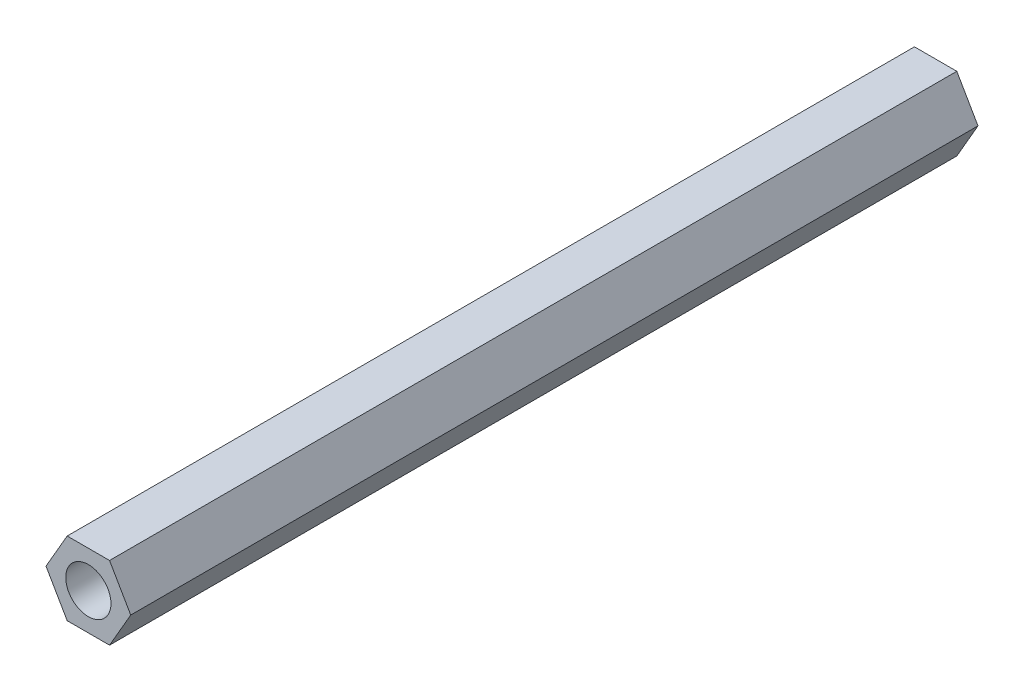
ISO-10303-21;
HEADER;
FILE_DESCRIPTION(('STEP AP214'),'2;1');
FILE_NAME('part.step','',(''),(''),'','','');
FILE_SCHEMA(('AUTOMOTIVE_DESIGN { 1 0 10303 214 1 1 1 1 }'));
ENDSEC;
DATA;
#1=APPLICATION_CONTEXT('core data for automotive mechanical design processes');
#2=APPLICATION_PROTOCOL_DEFINITION('international standard','automotive_design',2000,#1);
#3=PRODUCT_CONTEXT('',#1,'mechanical');
#4=PRODUCT('Part','Part','',(#3));
#5=PRODUCT_RELATED_PRODUCT_CATEGORY('part','',(#4));
#6=PRODUCT_DEFINITION_FORMATION('','',#4);
#7=PRODUCT_DEFINITION_CONTEXT('part definition',#1,'design');
#8=PRODUCT_DEFINITION('design','',#6,#7);
#9=PRODUCT_DEFINITION_SHAPE('','',#8);
#10=(LENGTH_UNIT() NAMED_UNIT(*) SI_UNIT(.MILLI.,.METRE.));
#11=(NAMED_UNIT(*) PLANE_ANGLE_UNIT() SI_UNIT($,.RADIAN.));
#12=(NAMED_UNIT(*) SI_UNIT($,.STERADIAN.) SOLID_ANGLE_UNIT());
#13=UNCERTAINTY_MEASURE_WITH_UNIT(LENGTH_MEASURE(1.E-05),#10,'distance_accuracy_value','');
#14=(GEOMETRIC_REPRESENTATION_CONTEXT(3) GLOBAL_UNCERTAINTY_ASSIGNED_CONTEXT((#13)) GLOBAL_UNIT_ASSIGNED_CONTEXT((#10,
#11,#12)) REPRESENTATION_CONTEXT('',''));
#15=CARTESIAN_POINT('',(0.,0.,0.));
#16=DIRECTION('',(0.,0.,1.));
#17=DIRECTION('',(1.,0.,0.));
#18=AXIS2_PLACEMENT_3D('',#15,#16,#17);
#19=CARTESIAN_POINT('',(0.,0.,60.));
#20=DIRECTION('',(0.,0.,1.));
#21=DIRECTION('',(1.,0.,0.));
#22=AXIS2_PLACEMENT_3D('',#19,#20,#21);
#23=PLANE('',#22);
#24=DIRECTION('',(0.5,0.866025403784438,0.));
#25=VECTOR('',#24,1.);
#26=CARTESIAN_POINT('',(1.5,-2.59807621135332,60.));
#27=LINE('',#26,#25);
#28=CARTESIAN_POINT('',(1.5,-2.59807621135332,60.));
#29=VERTEX_POINT('',#28);
#30=CARTESIAN_POINT('',(3.,0.,60.));
#31=VERTEX_POINT('',#30);
#32=EDGE_CURVE('E150',#29,#31,#27,.T.);
#33=ORIENTED_EDGE('',*,*,#32,.T.);
#34=DIRECTION('',(-0.5,0.866025403784439,0.));
#35=VECTOR('',#34,1.);
#36=CARTESIAN_POINT('',(3.,0.,60.));
#37=LINE('',#36,#35);
#38=CARTESIAN_POINT('',(1.5,2.59807621135332,60.));
#39=VERTEX_POINT('',#38);
#40=EDGE_CURVE('E98',#31,#39,#37,.T.);
#41=ORIENTED_EDGE('',*,*,#40,.T.);
#42=DIRECTION('',(-1.,0.,0.));
#43=VECTOR('',#42,1.);
#44=CARTESIAN_POINT('',(1.5,2.59807621135332,60.));
#45=LINE('',#44,#43);
#46=CARTESIAN_POINT('',(-1.5,2.59807621135332,60.));
#47=VERTEX_POINT('',#46);
#48=EDGE_CURVE('E111',#39,#47,#45,.T.);
#49=ORIENTED_EDGE('',*,*,#48,.T.);
#50=DIRECTION('',(-0.5,-0.866025403784439,0.));
#51=VECTOR('',#50,1.);
#52=CARTESIAN_POINT('',(-1.5,2.59807621135332,60.));
#53=LINE('',#52,#51);
#54=CARTESIAN_POINT('',(-3.,0.,60.));
#55=VERTEX_POINT('',#54);
#56=EDGE_CURVE('E105',#47,#55,#53,.T.);
#57=ORIENTED_EDGE('',*,*,#56,.T.);
#58=DIRECTION('',(0.5,-0.866025403784439,0.));
#59=VECTOR('',#58,1.);
#60=CARTESIAN_POINT('',(-3.,0.,60.));
#61=LINE('',#60,#59);
#62=CARTESIAN_POINT('',(-1.5,-2.59807621135332,60.));
#63=VERTEX_POINT('',#62);
#64=EDGE_CURVE('E109',#55,#63,#61,.T.);
#65=ORIENTED_EDGE('',*,*,#64,.T.);
#66=DIRECTION('',(1.,0.,0.));
#67=VECTOR('',#66,1.);
#68=CARTESIAN_POINT('',(-1.5,-2.59807621135332,60.));
#69=LINE('',#68,#67);
#70=EDGE_CURVE('E61',#63,#29,#69,.T.);
#71=ORIENTED_EDGE('',*,*,#70,.T.);
#72=EDGE_LOOP('',(#33,#41,#49,#57,#65,#71));
#73=FACE_BOUND('',#72,.T.);
#74=CARTESIAN_POINT('',(0.,0.,60.));
#75=DIRECTION('',(0.,0.,1.));
#76=DIRECTION('',(1.,0.,0.));
#77=AXIS2_PLACEMENT_3D('',#74,#75,#76);
#78=CIRCLE('',#77,1.6);
#79=CARTESIAN_POINT('',(1.6,0.,60.));
#80=VERTEX_POINT('',#79);
#81=EDGE_CURVE('E138',#80,#80,#78,.T.);
#82=ORIENTED_EDGE('',*,*,#81,.F.);
#83=EDGE_LOOP('',(#82));
#84=FACE_BOUND('',#83,.T.);
#85=ADVANCED_FACE('F43',(#73,#84),#23,.T.);
#86=CARTESIAN_POINT('',(0.,0.,0.));
#87=DIRECTION('',(0.,0.,1.));
#88=DIRECTION('',(1.,0.,0.));
#89=AXIS2_PLACEMENT_3D('',#86,#87,#88);
#90=PLANE('',#89);
#91=DIRECTION('',(0.5,0.866025403784438,0.));
#92=VECTOR('',#91,1.);
#93=CARTESIAN_POINT('',(1.5,-2.59807621135332,0.));
#94=LINE('',#93,#92);
#95=CARTESIAN_POINT('',(1.5,-2.59807621135332,0.));
#96=VERTEX_POINT('',#95);
#97=CARTESIAN_POINT('',(3.,0.,0.));
#98=VERTEX_POINT('',#97);
#99=EDGE_CURVE('E133',#96,#98,#94,.T.);
#100=ORIENTED_EDGE('',*,*,#99,.F.);
#101=DIRECTION('',(1.,0.,0.));
#102=VECTOR('',#101,1.);
#103=CARTESIAN_POINT('',(-1.5,-2.59807621135332,0.));
#104=LINE('',#103,#102);
#105=CARTESIAN_POINT('',(-1.5,-2.59807621135332,0.));
#106=VERTEX_POINT('',#105);
#107=EDGE_CURVE('E90',#106,#96,#104,.T.);
#108=ORIENTED_EDGE('',*,*,#107,.F.);
#109=DIRECTION('',(0.5,-0.866025403784439,0.));
#110=VECTOR('',#109,1.);
#111=CARTESIAN_POINT('',(-3.,0.,0.));
#112=LINE('',#111,#110);
#113=CARTESIAN_POINT('',(-3.,0.,0.));
#114=VERTEX_POINT('',#113);
#115=EDGE_CURVE('E84',#114,#106,#112,.T.);
#116=ORIENTED_EDGE('',*,*,#115,.F.);
#117=DIRECTION('',(-0.5,-0.866025403784439,0.));
#118=VECTOR('',#117,1.);
#119=CARTESIAN_POINT('',(-1.5,2.59807621135332,0.));
#120=LINE('',#119,#118);
#121=CARTESIAN_POINT('',(-1.5,2.59807621135332,0.));
#122=VERTEX_POINT('',#121);
#123=EDGE_CURVE('E120',#122,#114,#120,.T.);
#124=ORIENTED_EDGE('',*,*,#123,.F.);
#125=DIRECTION('',(-1.,0.,0.));
#126=VECTOR('',#125,1.);
#127=CARTESIAN_POINT('',(1.5,2.59807621135332,0.));
#128=LINE('',#127,#126);
#129=CARTESIAN_POINT('',(1.5,2.59807621135332,0.));
#130=VERTEX_POINT('',#129);
#131=EDGE_CURVE('E141',#130,#122,#128,.T.);
#132=ORIENTED_EDGE('',*,*,#131,.F.);
#133=DIRECTION('',(-0.5,0.866025403784439,0.));
#134=VECTOR('',#133,1.);
#135=CARTESIAN_POINT('',(3.,0.,0.));
#136=LINE('',#135,#134);
#137=EDGE_CURVE('E137',#98,#130,#136,.T.);
#138=ORIENTED_EDGE('',*,*,#137,.F.);
#139=EDGE_LOOP('',(#100,#108,#116,#124,#132,#138));
#140=FACE_BOUND('',#139,.T.);
#141=CARTESIAN_POINT('',(0.,0.,0.));
#142=DIRECTION('',(0.,0.,1.));
#143=DIRECTION('',(1.,0.,0.));
#144=AXIS2_PLACEMENT_3D('',#141,#142,#143);
#145=CIRCLE('',#144,1.6);
#146=CARTESIAN_POINT('',(1.6,0.,0.));
#147=VERTEX_POINT('',#146);
#148=EDGE_CURVE('E265',#147,#147,#145,.T.);
#149=ORIENTED_EDGE('',*,*,#148,.T.);
#150=EDGE_LOOP('',(#149));
#151=FACE_BOUND('',#150,.T.);
#152=ADVANCED_FACE('F163',(#140,#151),#90,.F.);
#153=CARTESIAN_POINT('',(1.5,-2.59807621135332,60.));
#154=DIRECTION('',(-0.866025403784439,0.5,0.));
#155=DIRECTION('',(-0.5,-0.866025403784439,0.));
#156=AXIS2_PLACEMENT_3D('',#153,#154,#155);
#157=PLANE('',#156);
#158=ORIENTED_EDGE('',*,*,#99,.T.);
#159=DIRECTION('',(0.,0.,-1.));
#160=VECTOR('',#159,1.);
#161=CARTESIAN_POINT('',(3.,0.,60.));
#162=LINE('',#161,#160);
#163=EDGE_CURVE('E11',#31,#98,#162,.T.);
#164=ORIENTED_EDGE('',*,*,#163,.F.);
#165=ORIENTED_EDGE('',*,*,#32,.F.);
#166=DIRECTION('',(0.,0.,-1.));
#167=VECTOR('',#166,1.);
#168=CARTESIAN_POINT('',(1.5,-2.59807621135332,60.));
#169=LINE('',#168,#167);
#170=EDGE_CURVE('E129',#29,#96,#169,.T.);
#171=ORIENTED_EDGE('',*,*,#170,.T.);
#172=EDGE_LOOP('',(#158,#164,#165,#171));
#173=FACE_BOUND('',#172,.T.);
#174=ADVANCED_FACE('F45',(#173),#157,.F.);
#175=CARTESIAN_POINT('',(3.,0.,60.));
#176=DIRECTION('',(-0.866025403784439,-0.5,0.));
#177=DIRECTION('',(0.5,-0.866025403784439,0.));
#178=AXIS2_PLACEMENT_3D('',#175,#176,#177);
#179=PLANE('',#178);
#180=ORIENTED_EDGE('',*,*,#137,.T.);
#181=DIRECTION('',(0.,0.,-1.));
#182=VECTOR('',#181,1.);
#183=CARTESIAN_POINT('',(1.5,2.59807621135332,60.));
#184=LINE('',#183,#182);
#185=EDGE_CURVE('E53',#39,#130,#184,.T.);
#186=ORIENTED_EDGE('',*,*,#185,.F.);
#187=ORIENTED_EDGE('',*,*,#40,.F.);
#188=ORIENTED_EDGE('',*,*,#163,.T.);
#189=EDGE_LOOP('',(#180,#186,#187,#188));
#190=FACE_BOUND('',#189,.T.);
#191=ADVANCED_FACE('F188',(#190),#179,.F.);
#192=CARTESIAN_POINT('',(1.5,2.59807621135332,60.));
#193=DIRECTION('',(0.,-1.,0.));
#194=DIRECTION('',(1.,0.,0.));
#195=AXIS2_PLACEMENT_3D('',#192,#193,#194);
#196=PLANE('',#195);
#197=ORIENTED_EDGE('',*,*,#131,.T.);
#198=DIRECTION('',(0.,0.,-1.));
#199=VECTOR('',#198,1.);
#200=CARTESIAN_POINT('',(-1.5,2.59807621135332,60.));
#201=LINE('',#200,#199);
#202=EDGE_CURVE('E122',#47,#122,#201,.T.);
#203=ORIENTED_EDGE('',*,*,#202,.F.);
#204=ORIENTED_EDGE('',*,*,#48,.F.);
#205=ORIENTED_EDGE('',*,*,#185,.T.);
#206=EDGE_LOOP('',(#197,#203,#204,#205));
#207=FACE_BOUND('',#206,.T.);
#208=ADVANCED_FACE('F160',(#207),#196,.F.);
#209=CARTESIAN_POINT('',(-1.5,2.59807621135332,60.));
#210=DIRECTION('',(0.866025403784439,-0.5,0.));
#211=DIRECTION('',(0.5,0.866025403784439,0.));
#212=AXIS2_PLACEMENT_3D('',#209,#210,#211);
#213=PLANE('',#212);
#214=ORIENTED_EDGE('',*,*,#123,.T.);
#215=DIRECTION('',(0.,0.,-1.));
#216=VECTOR('',#215,1.);
#217=CARTESIAN_POINT('',(-3.,0.,60.));
#218=LINE('',#217,#216);
#219=EDGE_CURVE('E117',#55,#114,#218,.T.);
#220=ORIENTED_EDGE('',*,*,#219,.F.);
#221=ORIENTED_EDGE('',*,*,#56,.F.);
#222=ORIENTED_EDGE('',*,*,#202,.T.);
#223=EDGE_LOOP('',(#214,#220,#221,#222));
#224=FACE_BOUND('',#223,.T.);
#225=ADVANCED_FACE('F118',(#224),#213,.F.);
#226=CARTESIAN_POINT('',(-3.,0.,60.));
#227=DIRECTION('',(0.866025403784439,0.5,0.));
#228=DIRECTION('',(-0.5,0.866025403784439,0.));
#229=AXIS2_PLACEMENT_3D('',#226,#227,#228);
#230=PLANE('',#229);
#231=ORIENTED_EDGE('',*,*,#115,.T.);
#232=DIRECTION('',(0.,0.,-1.));
#233=VECTOR('',#232,1.);
#234=CARTESIAN_POINT('',(-1.5,-2.59807621135332,60.));
#235=LINE('',#234,#233);
#236=EDGE_CURVE('E123',#63,#106,#235,.T.);
#237=ORIENTED_EDGE('',*,*,#236,.F.);
#238=ORIENTED_EDGE('',*,*,#64,.F.);
#239=ORIENTED_EDGE('',*,*,#219,.T.);
#240=EDGE_LOOP('',(#231,#237,#238,#239));
#241=FACE_BOUND('',#240,.T.);
#242=ADVANCED_FACE('F125',(#241),#230,.F.);
#243=CARTESIAN_POINT('',(-1.5,-2.59807621135332,60.));
#244=DIRECTION('',(0.,1.,0.));
#245=DIRECTION('',(0.,0.,1.));
#246=AXIS2_PLACEMENT_3D('',#243,#244,#245);
#247=PLANE('',#246);
#248=ORIENTED_EDGE('',*,*,#107,.T.);
#249=ORIENTED_EDGE('',*,*,#170,.F.);
#250=ORIENTED_EDGE('',*,*,#70,.F.);
#251=ORIENTED_EDGE('',*,*,#236,.T.);
#252=EDGE_LOOP('',(#248,#249,#250,#251));
#253=FACE_BOUND('',#252,.T.);
#254=ADVANCED_FACE('F168',(#253),#247,.F.);
#255=CARTESIAN_POINT('',(0.,0.,60.));
#256=DIRECTION('',(0.,0.,-1.));
#257=DIRECTION('',(-1.,0.,0.));
#258=AXIS2_PLACEMENT_3D('',#255,#256,#257);
#259=CYLINDRICAL_SURFACE('',#258,1.6);
#260=ORIENTED_EDGE('',*,*,#81,.T.);
#261=EDGE_LOOP('',(#260));
#262=FACE_BOUND('',#261,.T.);
#263=ORIENTED_EDGE('',*,*,#148,.F.);
#264=EDGE_LOOP('',(#263));
#265=FACE_BOUND('',#264,.T.);
#266=ADVANCED_FACE('F170',(#262,#265),#259,.F.);
#267=CLOSED_SHELL('',(#85,#152,#174,#191,#208,#225,#242,#254,#266));
#268=MANIFOLD_SOLID_BREP('B2',#267);
#269=ADVANCED_BREP_SHAPE_REPRESENTATION('',(#18,#268),#14);
#270=SHAPE_DEFINITION_REPRESENTATION(#9,#269);
ENDSEC;
END-ISO-10303-21;
